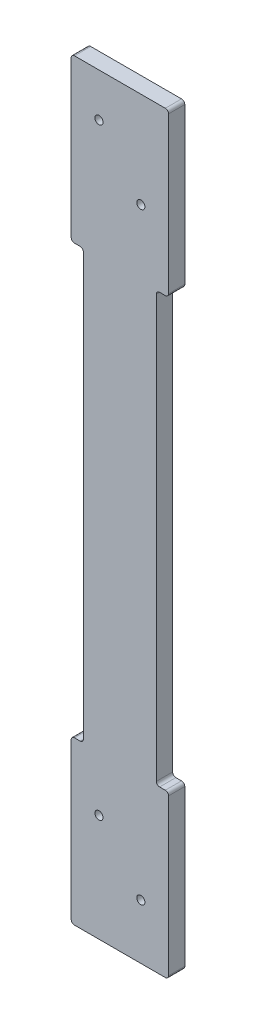
ISO-10303-21;
HEADER;
FILE_DESCRIPTION(('STEP AP214'),'2;1');
FILE_NAME('part.step','',(''),(''),'','','');
FILE_SCHEMA(('AUTOMOTIVE_DESIGN { 1 0 10303 214 1 1 1 1 }'));
ENDSEC;
DATA;
#1=APPLICATION_CONTEXT('core data for automotive mechanical design processes');
#2=APPLICATION_PROTOCOL_DEFINITION('international standard','automotive_design',2000,#1);
#3=PRODUCT_CONTEXT('',#1,'mechanical');
#4=PRODUCT('Part','Part','',(#3));
#5=PRODUCT_RELATED_PRODUCT_CATEGORY('part','',(#4));
#6=PRODUCT_DEFINITION_FORMATION('','',#4);
#7=PRODUCT_DEFINITION_CONTEXT('part definition',#1,'design');
#8=PRODUCT_DEFINITION('design','',#6,#7);
#9=PRODUCT_DEFINITION_SHAPE('','',#8);
#10=(LENGTH_UNIT() NAMED_UNIT(*) SI_UNIT(.MILLI.,.METRE.));
#11=(NAMED_UNIT(*) PLANE_ANGLE_UNIT() SI_UNIT($,.RADIAN.));
#12=(NAMED_UNIT(*) SI_UNIT($,.STERADIAN.) SOLID_ANGLE_UNIT());
#13=UNCERTAINTY_MEASURE_WITH_UNIT(LENGTH_MEASURE(1.E-05),#10,'distance_accuracy_value','');
#14=(GEOMETRIC_REPRESENTATION_CONTEXT(3) GLOBAL_UNCERTAINTY_ASSIGNED_CONTEXT((#13)) GLOBAL_UNIT_ASSIGNED_CONTEXT((#10,
#11,#12)) REPRESENTATION_CONTEXT('',''));
#15=CARTESIAN_POINT('',(0.,0.,0.));
#16=DIRECTION('',(0.,0.,1.));
#17=DIRECTION('',(1.,0.,0.));
#18=AXIS2_PLACEMENT_3D('',#15,#16,#17);
#19=CARTESIAN_POINT('',(0.,-421.200669102115,10.));
#20=DIRECTION('',(0.,1.,0.));
#21=DIRECTION('',(0.,0.,1.));
#22=AXIS2_PLACEMENT_3D('',#19,#20,#21);
#23=PLANE('',#22);
#24=DIRECTION('',(1.,0.,0.));
#25=VECTOR('',#24,1.);
#26=CARTESIAN_POINT('',(0.,-421.200669102115,0.));
#27=LINE('',#26,#25);
#28=CARTESIAN_POINT('',(27.0000000000014,-421.200669102115,0.));
#29=VERTEX_POINT('',#28);
#30=CARTESIAN_POINT('',(83.0000000000014,-421.200669102115,0.));
#31=VERTEX_POINT('',#30);
#32=EDGE_CURVE('E227',#29,#31,#27,.T.);
#33=ORIENTED_EDGE('',*,*,#32,.T.);
#34=DIRECTION('',(0.,0.,-1.));
#35=VECTOR('',#34,1.);
#36=CARTESIAN_POINT('',(83.0000000000014,-421.200669102115,10.));
#37=LINE('',#36,#35);
#38=CARTESIAN_POINT('',(83.0000000000014,-421.200669102115,10.));
#39=VERTEX_POINT('',#38);
#40=EDGE_CURVE('E204',#31,#39,#37,.F.);
#41=ORIENTED_EDGE('',*,*,#40,.T.);
#42=DIRECTION('',(1.,0.,0.));
#43=VECTOR('',#42,1.);
#44=CARTESIAN_POINT('',(0.,-421.200669102115,10.));
#45=LINE('',#44,#43);
#46=CARTESIAN_POINT('',(27.0000000000014,-421.200669102115,10.));
#47=VERTEX_POINT('',#46);
#48=EDGE_CURVE('E471',#47,#39,#45,.T.);
#49=ORIENTED_EDGE('',*,*,#48,.F.);
#50=DIRECTION('',(0.,0.,-1.));
#51=VECTOR('',#50,1.);
#52=CARTESIAN_POINT('',(27.0000000000014,-421.200669102115,0.));
#53=LINE('',#52,#51);
#54=EDGE_CURVE('E209',#47,#29,#53,.T.);
#55=ORIENTED_EDGE('',*,*,#54,.T.);
#56=EDGE_LOOP('',(#33,#41,#49,#55));
#57=FACE_BOUND('',#56,.T.);
#58=ADVANCED_FACE('F37',(#57),#23,.F.);
#59=CARTESIAN_POINT('',(85.0000000000014,0.,10.));
#60=DIRECTION('',(-1.,0.,0.));
#61=DIRECTION('',(0.,0.,1.));
#62=AXIS2_PLACEMENT_3D('',#59,#60,#61);
#63=PLANE('',#62);
#64=DIRECTION('',(0.,1.,0.));
#65=VECTOR('',#64,1.);
#66=CARTESIAN_POINT('',(85.0000000000014,0.,10.));
#67=LINE('',#66,#65);
#68=CARTESIAN_POINT('',(85.0000000000014,-419.200669102115,10.));
#69=VERTEX_POINT('',#68);
#70=CARTESIAN_POINT('',(85.0000000000014,-323.200669102115,10.));
#71=VERTEX_POINT('',#70);
#72=EDGE_CURVE('E219',#69,#71,#67,.T.);
#73=ORIENTED_EDGE('',*,*,#72,.F.);
#74=DIRECTION('',(0.,0.,-1.));
#75=VECTOR('',#74,1.);
#76=CARTESIAN_POINT('',(85.0000000000014,-419.200669102115,10.));
#77=LINE('',#76,#75);
#78=CARTESIAN_POINT('',(85.0000000000014,-419.200669102115,0.));
#79=VERTEX_POINT('',#78);
#80=EDGE_CURVE('E203',#69,#79,#77,.T.);
#81=ORIENTED_EDGE('',*,*,#80,.T.);
#82=DIRECTION('',(0.,1.,0.));
#83=VECTOR('',#82,1.);
#84=CARTESIAN_POINT('',(85.0000000000014,0.,0.));
#85=LINE('',#84,#83);
#86=CARTESIAN_POINT('',(85.0000000000014,-323.200669102115,0.));
#87=VERTEX_POINT('',#86);
#88=EDGE_CURVE('E216',#79,#87,#85,.T.);
#89=ORIENTED_EDGE('',*,*,#88,.T.);
#90=DIRECTION('',(0.,0.,-1.));
#91=VECTOR('',#90,1.);
#92=CARTESIAN_POINT('',(85.0000000000014,-323.200669102115,10.));
#93=LINE('',#92,#91);
#94=EDGE_CURVE('E221',#87,#71,#93,.F.);
#95=ORIENTED_EDGE('',*,*,#94,.T.);
#96=EDGE_LOOP('',(#73,#81,#89,#95));
#97=FACE_BOUND('',#96,.T.);
#98=ADVANCED_FACE('F215',(#97),#63,.F.);
#99=CARTESIAN_POINT('',(0.,-321.200669102115,10.));
#100=DIRECTION('',(0.,1.,0.));
#101=DIRECTION('',(0.,0.,1.));
#102=AXIS2_PLACEMENT_3D('',#99,#100,#101);
#103=PLANE('',#102);
#104=DIRECTION('',(1.,0.,0.));
#105=VECTOR('',#104,1.);
#106=CARTESIAN_POINT('',(0.,-321.200669102115,10.));
#107=LINE('',#106,#105);
#108=CARTESIAN_POINT('',(79.5000000000014,-321.200669102115,10.));
#109=VERTEX_POINT('',#108);
#110=CARTESIAN_POINT('',(83.0000000000014,-321.200669102115,10.));
#111=VERTEX_POINT('',#110);
#112=EDGE_CURVE('E384',#109,#111,#107,.T.);
#113=ORIENTED_EDGE('',*,*,#112,.T.);
#114=DIRECTION('',(0.,0.,-1.));
#115=VECTOR('',#114,1.);
#116=CARTESIAN_POINT('',(83.0000000000014,-321.200669102115,0.));
#117=LINE('',#116,#115);
#118=CARTESIAN_POINT('',(83.0000000000014,-321.200669102115,0.));
#119=VERTEX_POINT('',#118);
#120=EDGE_CURVE('E298',#111,#119,#117,.T.);
#121=ORIENTED_EDGE('',*,*,#120,.T.);
#122=DIRECTION('',(1.,0.,0.));
#123=VECTOR('',#122,1.);
#124=CARTESIAN_POINT('',(0.,-321.200669102115,0.));
#125=LINE('',#124,#123);
#126=CARTESIAN_POINT('',(79.5000000000014,-321.200669102115,0.));
#127=VERTEX_POINT('',#126);
#128=EDGE_CURVE('E226',#127,#119,#125,.T.);
#129=ORIENTED_EDGE('',*,*,#128,.F.);
#130=DIRECTION('',(0.,0.,-1.));
#131=VECTOR('',#130,1.);
#132=CARTESIAN_POINT('',(79.5000000000014,-321.200669102115,10.));
#133=LINE('',#132,#131);
#134=EDGE_CURVE('E296',#127,#109,#133,.F.);
#135=ORIENTED_EDGE('',*,*,#134,.T.);
#136=EDGE_LOOP('',(#113,#121,#129,#135));
#137=FACE_BOUND('',#136,.T.);
#138=ADVANCED_FACE('F425',(#137),#103,.T.);
#139=CARTESIAN_POINT('',(77.5000000000013,0.,10.));
#140=DIRECTION('',(-1.,0.,0.));
#141=DIRECTION('',(0.,-1.,0.));
#142=AXIS2_PLACEMENT_3D('',#139,#140,#141);
#143=PLANE('',#142);
#144=DIRECTION('',(0.,1.,0.));
#145=VECTOR('',#144,1.);
#146=CARTESIAN_POINT('',(77.5000000000013,0.,10.));
#147=LINE('',#146,#145);
#148=CARTESIAN_POINT('',(77.5000000000014,-319.200669102115,10.));
#149=VERTEX_POINT('',#148);
#150=CARTESIAN_POINT('',(77.5000000000013,-59.1428571428576,10.));
#151=VERTEX_POINT('',#150);
#152=EDGE_CURVE('E477',#149,#151,#147,.T.);
#153=ORIENTED_EDGE('',*,*,#152,.F.);
#154=DIRECTION('',(0.,0.,-1.));
#155=VECTOR('',#154,1.);
#156=CARTESIAN_POINT('',(77.5000000000014,-319.200669102115,10.));
#157=LINE('',#156,#155);
#158=CARTESIAN_POINT('',(77.5000000000014,-319.200669102115,0.));
#159=VERTEX_POINT('',#158);
#160=EDGE_CURVE('E303',#149,#159,#157,.T.);
#161=ORIENTED_EDGE('',*,*,#160,.T.);
#162=DIRECTION('',(0.,1.,0.));
#163=VECTOR('',#162,1.);
#164=CARTESIAN_POINT('',(77.5000000000013,0.,0.));
#165=LINE('',#164,#163);
#166=CARTESIAN_POINT('',(77.5000000000013,-59.1428571428576,0.));
#167=VERTEX_POINT('',#166);
#168=EDGE_CURVE('E229',#159,#167,#165,.T.);
#169=ORIENTED_EDGE('',*,*,#168,.T.);
#170=DIRECTION('',(0.,0.,-1.));
#171=VECTOR('',#170,1.);
#172=CARTESIAN_POINT('',(77.5000000000013,-59.1428571428576,10.));
#173=LINE('',#172,#171);
#174=EDGE_CURVE('E301',#167,#151,#173,.F.);
#175=ORIENTED_EDGE('',*,*,#174,.T.);
#176=EDGE_LOOP('',(#153,#161,#169,#175));
#177=FACE_BOUND('',#176,.T.);
#178=ADVANCED_FACE('F428',(#177),#143,.F.);
#179=CARTESIAN_POINT('',(0.,-57.1428571428576,10.));
#180=DIRECTION('',(0.,1.,0.));
#181=DIRECTION('',(-1.,0.,0.));
#182=AXIS2_PLACEMENT_3D('',#179,#180,#181);
#183=PLANE('',#182);
#184=DIRECTION('',(1.,0.,0.));
#185=VECTOR('',#184,1.);
#186=CARTESIAN_POINT('',(0.,-57.1428571428576,10.));
#187=LINE('',#186,#185);
#188=CARTESIAN_POINT('',(79.5000000000013,-57.1428571428576,10.));
#189=VERTEX_POINT('',#188);
#190=CARTESIAN_POINT('',(83.0000000000014,-57.1428571428576,10.));
#191=VERTEX_POINT('',#190);
#192=EDGE_CURVE('E387',#189,#191,#187,.T.);
#193=ORIENTED_EDGE('',*,*,#192,.F.);
#194=DIRECTION('',(0.,0.,-1.));
#195=VECTOR('',#194,1.);
#196=CARTESIAN_POINT('',(79.5000000000013,-57.1428571428576,0.));
#197=LINE('',#196,#195);
#198=CARTESIAN_POINT('',(79.5000000000013,-57.1428571428576,0.));
#199=VERTEX_POINT('',#198);
#200=EDGE_CURVE('E322',#189,#199,#197,.T.);
#201=ORIENTED_EDGE('',*,*,#200,.T.);
#202=DIRECTION('',(1.,0.,0.));
#203=VECTOR('',#202,1.);
#204=CARTESIAN_POINT('',(0.,-57.1428571428576,0.));
#205=LINE('',#204,#203);
#206=CARTESIAN_POINT('',(83.0000000000014,-57.1428571428576,0.));
#207=VERTEX_POINT('',#206);
#208=EDGE_CURVE('E238',#199,#207,#205,.T.);
#209=ORIENTED_EDGE('',*,*,#208,.T.);
#210=DIRECTION('',(0.,0.,-1.));
#211=VECTOR('',#210,1.);
#212=CARTESIAN_POINT('',(83.0000000000014,-57.1428571428576,10.));
#213=LINE('',#212,#211);
#214=EDGE_CURVE('E320',#207,#191,#213,.F.);
#215=ORIENTED_EDGE('',*,*,#214,.T.);
#216=EDGE_LOOP('',(#193,#201,#209,#215));
#217=FACE_BOUND('',#216,.T.);
#218=ADVANCED_FACE('F431',(#217),#183,.F.);
#219=CARTESIAN_POINT('',(85.0000000000014,0.,10.));
#220=DIRECTION('',(1.,0.,0.));
#221=DIRECTION('',(0.,0.,-1.));
#222=AXIS2_PLACEMENT_3D('',#219,#220,#221);
#223=PLANE('',#222);
#224=DIRECTION('',(0.,-1.,0.));
#225=VECTOR('',#224,1.);
#226=CARTESIAN_POINT('',(85.0000000000014,0.,10.));
#227=LINE('',#226,#225);
#228=CARTESIAN_POINT('',(85.0000000000014,40.8571428571424,10.));
#229=VERTEX_POINT('',#228);
#230=CARTESIAN_POINT('',(85.0000000000014,-55.1428571428576,10.));
#231=VERTEX_POINT('',#230);
#232=EDGE_CURVE('E480',#229,#231,#227,.T.);
#233=ORIENTED_EDGE('',*,*,#232,.T.);
#234=DIRECTION('',(0.,0.,-1.));
#235=VECTOR('',#234,1.);
#236=CARTESIAN_POINT('',(85.0000000000014,-55.1428571428576,0.));
#237=LINE('',#236,#235);
#238=CARTESIAN_POINT('',(85.0000000000014,-55.1428571428576,0.));
#239=VERTEX_POINT('',#238);
#240=EDGE_CURVE('E327',#231,#239,#237,.T.);
#241=ORIENTED_EDGE('',*,*,#240,.T.);
#242=DIRECTION('',(0.,-1.,0.));
#243=VECTOR('',#242,1.);
#244=CARTESIAN_POINT('',(85.0000000000014,0.,0.));
#245=LINE('',#244,#243);
#246=CARTESIAN_POINT('',(85.0000000000014,40.8571428571424,0.));
#247=VERTEX_POINT('',#246);
#248=EDGE_CURVE('E241',#247,#239,#245,.T.);
#249=ORIENTED_EDGE('',*,*,#248,.F.);
#250=DIRECTION('',(0.,0.,-1.));
#251=VECTOR('',#250,1.);
#252=CARTESIAN_POINT('',(85.0000000000014,40.8571428571424,10.));
#253=LINE('',#252,#251);
#254=EDGE_CURVE('E325',#247,#229,#253,.F.);
#255=ORIENTED_EDGE('',*,*,#254,.T.);
#256=EDGE_LOOP('',(#233,#241,#249,#255));
#257=FACE_BOUND('',#256,.T.);
#258=ADVANCED_FACE('F433',(#257),#223,.T.);
#259=CARTESIAN_POINT('',(0.,42.8571428571424,10.));
#260=DIRECTION('',(0.,1.,0.));
#261=DIRECTION('',(-1.,0.,0.));
#262=AXIS2_PLACEMENT_3D('',#259,#260,#261);
#263=PLANE('',#262);
#264=DIRECTION('',(1.,0.,0.));
#265=VECTOR('',#264,1.);
#266=CARTESIAN_POINT('',(0.,42.8571428571424,10.));
#267=LINE('',#266,#265);
#268=CARTESIAN_POINT('',(27.0000000000014,42.8571428571424,10.));
#269=VERTEX_POINT('',#268);
#270=CARTESIAN_POINT('',(83.0000000000014,42.8571428571424,10.));
#271=VERTEX_POINT('',#270);
#272=EDGE_CURVE('E482',#269,#271,#267,.T.);
#273=ORIENTED_EDGE('',*,*,#272,.T.);
#274=DIRECTION('',(0.,0.,-1.));
#275=VECTOR('',#274,1.);
#276=CARTESIAN_POINT('',(83.0000000000014,42.8571428571424,10.));
#277=LINE('',#276,#275);
#278=CARTESIAN_POINT('',(83.0000000000014,42.8571428571424,0.));
#279=VERTEX_POINT('',#278);
#280=EDGE_CURVE('E332',#271,#279,#277,.T.);
#281=ORIENTED_EDGE('',*,*,#280,.T.);
#282=DIRECTION('',(1.,0.,0.));
#283=VECTOR('',#282,1.);
#284=CARTESIAN_POINT('',(0.,42.8571428571424,0.));
#285=LINE('',#284,#283);
#286=CARTESIAN_POINT('',(27.0000000000014,42.8571428571424,0.));
#287=VERTEX_POINT('',#286);
#288=EDGE_CURVE('E245',#287,#279,#285,.T.);
#289=ORIENTED_EDGE('',*,*,#288,.F.);
#290=DIRECTION('',(0.,0.,-1.));
#291=VECTOR('',#290,1.);
#292=CARTESIAN_POINT('',(27.0000000000014,42.8571428571424,10.));
#293=LINE('',#292,#291);
#294=EDGE_CURVE('E330',#287,#269,#293,.F.);
#295=ORIENTED_EDGE('',*,*,#294,.T.);
#296=EDGE_LOOP('',(#273,#281,#289,#295));
#297=FACE_BOUND('',#296,.T.);
#298=ADVANCED_FACE('F436',(#297),#263,.T.);
#299=CARTESIAN_POINT('',(25.0000000000014,0.,10.));
#300=DIRECTION('',(1.,0.,0.));
#301=DIRECTION('',(0.,1.,0.));
#302=AXIS2_PLACEMENT_3D('',#299,#300,#301);
#303=PLANE('',#302);
#304=DIRECTION('',(0.,-1.,0.));
#305=VECTOR('',#304,1.);
#306=CARTESIAN_POINT('',(25.0000000000014,0.,10.));
#307=LINE('',#306,#305);
#308=CARTESIAN_POINT('',(25.0000000000013,40.8571428571424,10.));
#309=VERTEX_POINT('',#308);
#310=CARTESIAN_POINT('',(25.0000000000014,-55.1428571428576,10.));
#311=VERTEX_POINT('',#310);
#312=EDGE_CURVE('E385',#309,#311,#307,.T.);
#313=ORIENTED_EDGE('',*,*,#312,.F.);
#314=DIRECTION('',(0.,0.,-1.));
#315=VECTOR('',#314,1.);
#316=CARTESIAN_POINT('',(25.0000000000013,40.8571428571424,0.));
#317=LINE('',#316,#315);
#318=CARTESIAN_POINT('',(25.0000000000013,40.8571428571424,0.));
#319=VERTEX_POINT('',#318);
#320=EDGE_CURVE('E337',#309,#319,#317,.T.);
#321=ORIENTED_EDGE('',*,*,#320,.T.);
#322=DIRECTION('',(0.,-1.,0.));
#323=VECTOR('',#322,1.);
#324=CARTESIAN_POINT('',(25.0000000000014,0.,0.));
#325=LINE('',#324,#323);
#326=CARTESIAN_POINT('',(25.0000000000014,-55.1428571428576,0.));
#327=VERTEX_POINT('',#326);
#328=EDGE_CURVE('E248',#319,#327,#325,.T.);
#329=ORIENTED_EDGE('',*,*,#328,.T.);
#330=DIRECTION('',(0.,0.,-1.));
#331=VECTOR('',#330,1.);
#332=CARTESIAN_POINT('',(25.0000000000014,-55.1428571428576,10.));
#333=LINE('',#332,#331);
#334=EDGE_CURVE('E335',#327,#311,#333,.F.);
#335=ORIENTED_EDGE('',*,*,#334,.T.);
#336=EDGE_LOOP('',(#313,#321,#329,#335));
#337=FACE_BOUND('',#336,.T.);
#338=ADVANCED_FACE('F440',(#337),#303,.F.);
#339=CARTESIAN_POINT('',(27.0000000000014,-57.1428571428576,10.));
#340=VERTEX_POINT('',#339);
#341=CARTESIAN_POINT('',(30.5000000000014,-57.1428571428576,10.));
#342=VERTEX_POINT('',#341);
#343=EDGE_CURVE('E375',#340,#342,#187,.T.);
#344=ORIENTED_EDGE('',*,*,#343,.F.);
#345=DIRECTION('',(0.,0.,-1.));
#346=VECTOR('',#345,1.);
#347=CARTESIAN_POINT('',(27.0000000000014,-57.1428571428576,10.));
#348=LINE('',#347,#346);
#349=CARTESIAN_POINT('',(27.0000000000014,-57.1428571428576,0.));
#350=VERTEX_POINT('',#349);
#351=EDGE_CURVE('E342',#340,#350,#348,.T.);
#352=ORIENTED_EDGE('',*,*,#351,.T.);
#353=CARTESIAN_POINT('',(30.5000000000014,-57.1428571428576,0.));
#354=VERTEX_POINT('',#353);
#355=EDGE_CURVE('E242',#350,#354,#205,.T.);
#356=ORIENTED_EDGE('',*,*,#355,.T.);
#357=DIRECTION('',(0.,0.,-1.));
#358=VECTOR('',#357,1.);
#359=CARTESIAN_POINT('',(30.5000000000014,-57.1428571428576,10.));
#360=LINE('',#359,#358);
#361=EDGE_CURVE('E340',#354,#342,#360,.F.);
#362=ORIENTED_EDGE('',*,*,#361,.T.);
#363=EDGE_LOOP('',(#344,#352,#356,#362));
#364=FACE_BOUND('',#363,.T.);
#365=ADVANCED_FACE('F364',(#364),#183,.F.);
#366=CARTESIAN_POINT('',(32.5000000000014,0.,10.));
#367=DIRECTION('',(-1.,0.,0.));
#368=DIRECTION('',(0.,0.,1.));
#369=AXIS2_PLACEMENT_3D('',#366,#367,#368);
#370=PLANE('',#369);
#371=DIRECTION('',(0.,1.,0.));
#372=VECTOR('',#371,1.);
#373=CARTESIAN_POINT('',(32.5000000000014,0.,0.));
#374=LINE('',#373,#372);
#375=CARTESIAN_POINT('',(32.5000000000014,-319.200669102115,0.));
#376=VERTEX_POINT('',#375);
#377=CARTESIAN_POINT('',(32.5000000000014,-59.1428571428576,0.));
#378=VERTEX_POINT('',#377);
#379=EDGE_CURVE('E251',#376,#378,#374,.T.);
#380=ORIENTED_EDGE('',*,*,#379,.F.);
#381=DIRECTION('',(0.,0.,-1.));
#382=VECTOR('',#381,1.);
#383=CARTESIAN_POINT('',(32.5000000000014,-319.200669102115,10.));
#384=LINE('',#383,#382);
#385=CARTESIAN_POINT('',(32.5000000000014,-319.200669102115,10.));
#386=VERTEX_POINT('',#385);
#387=EDGE_CURVE('E314',#376,#386,#384,.F.);
#388=ORIENTED_EDGE('',*,*,#387,.T.);
#389=DIRECTION('',(0.,1.,0.));
#390=VECTOR('',#389,1.);
#391=CARTESIAN_POINT('',(32.5000000000014,0.,10.));
#392=LINE('',#391,#390);
#393=CARTESIAN_POINT('',(32.5000000000014,-59.1428571428576,10.));
#394=VERTEX_POINT('',#393);
#395=EDGE_CURVE('E373',#386,#394,#392,.T.);
#396=ORIENTED_EDGE('',*,*,#395,.T.);
#397=DIRECTION('',(0.,0.,-1.));
#398=VECTOR('',#397,1.);
#399=CARTESIAN_POINT('',(32.5000000000014,-59.1428571428576,10.));
#400=LINE('',#399,#398);
#401=EDGE_CURVE('E311',#394,#378,#400,.T.);
#402=ORIENTED_EDGE('',*,*,#401,.T.);
#403=EDGE_LOOP('',(#380,#388,#396,#402));
#404=FACE_BOUND('',#403,.T.);
#405=ADVANCED_FACE('F377',(#404),#370,.T.);
#406=CARTESIAN_POINT('',(27.0000000000014,-321.200669102115,10.));
#407=VERTEX_POINT('',#406);
#408=CARTESIAN_POINT('',(30.5000000000014,-321.200669102115,10.));
#409=VERTEX_POINT('',#408);
#410=EDGE_CURVE('E379',#407,#409,#107,.T.);
#411=ORIENTED_EDGE('',*,*,#410,.T.);
#412=DIRECTION('',(0.,0.,-1.));
#413=VECTOR('',#412,1.);
#414=CARTESIAN_POINT('',(30.5000000000014,-321.200669102115,0.));
#415=LINE('',#414,#413);
#416=CARTESIAN_POINT('',(30.5000000000014,-321.200669102115,0.));
#417=VERTEX_POINT('',#416);
#418=EDGE_CURVE('E308',#409,#417,#415,.T.);
#419=ORIENTED_EDGE('',*,*,#418,.T.);
#420=CARTESIAN_POINT('',(27.0000000000014,-321.200669102115,0.));
#421=VERTEX_POINT('',#420);
#422=EDGE_CURVE('E231',#421,#417,#125,.T.);
#423=ORIENTED_EDGE('',*,*,#422,.F.);
#424=DIRECTION('',(0.,0.,-1.));
#425=VECTOR('',#424,1.);
#426=CARTESIAN_POINT('',(27.0000000000014,-321.200669102115,10.));
#427=LINE('',#426,#425);
#428=EDGE_CURVE('E306',#421,#407,#427,.F.);
#429=ORIENTED_EDGE('',*,*,#428,.T.);
#430=EDGE_LOOP('',(#411,#419,#423,#429));
#431=FACE_BOUND('',#430,.T.);
#432=ADVANCED_FACE('F449',(#431),#103,.T.);
#433=CARTESIAN_POINT('',(42.0949203281673,16.1416620367931,10.));
#434=DIRECTION('',(0.,0.,-1.));
#435=DIRECTION('',(-1.,0.,0.));
#436=AXIS2_PLACEMENT_3D('',#433,#434,#435);
#437=CYLINDRICAL_SURFACE('',#436,2.5);
#438=CARTESIAN_POINT('',(42.0949203281673,16.1416620367931,10.));
#439=DIRECTION('',(0.,0.,1.));
#440=DIRECTION('',(1.,0.,0.));
#441=AXIS2_PLACEMENT_3D('',#438,#439,#440);
#442=CIRCLE('',#441,2.5);
#443=CARTESIAN_POINT('',(44.5949203281673,16.1416620367931,10.));
#444=VERTEX_POINT('',#443);
#445=EDGE_CURVE('E392',#444,#444,#442,.T.);
#446=ORIENTED_EDGE('',*,*,#445,.T.);
#447=EDGE_LOOP('',(#446));
#448=FACE_BOUND('',#447,.T.);
#449=CARTESIAN_POINT('',(42.0949203281673,16.1416620367931,0.));
#450=DIRECTION('',(0.,0.,1.));
#451=DIRECTION('',(1.,0.,0.));
#452=AXIS2_PLACEMENT_3D('',#449,#450,#451);
#453=CIRCLE('',#452,2.5);
#454=CARTESIAN_POINT('',(44.5949203281673,16.1416620367931,0.));
#455=VERTEX_POINT('',#454);
#456=EDGE_CURVE('E257',#455,#455,#453,.T.);
#457=ORIENTED_EDGE('',*,*,#456,.F.);
#458=EDGE_LOOP('',(#457));
#459=FACE_BOUND('',#458,.T.);
#460=ADVANCED_FACE('F416',(#448,#459),#437,.F.);
#461=CARTESIAN_POINT('',(25.0000000000014,0.,10.));
#462=DIRECTION('',(-1.,0.,0.));
#463=DIRECTION('',(0.,0.,1.));
#464=AXIS2_PLACEMENT_3D('',#461,#462,#463);
#465=PLANE('',#464);
#466=DIRECTION('',(0.,1.,0.));
#467=VECTOR('',#466,1.);
#468=CARTESIAN_POINT('',(25.0000000000014,0.,10.));
#469=LINE('',#468,#467);
#470=CARTESIAN_POINT('',(25.0000000000014,-419.200669102115,10.));
#471=VERTEX_POINT('',#470);
#472=CARTESIAN_POINT('',(25.0000000000014,-323.200669102115,10.));
#473=VERTEX_POINT('',#472);
#474=EDGE_CURVE('E382',#471,#473,#469,.T.);
#475=ORIENTED_EDGE('',*,*,#474,.T.);
#476=DIRECTION('',(0.,0.,-1.));
#477=VECTOR('',#476,1.);
#478=CARTESIAN_POINT('',(25.0000000000014,-323.200669102115,10.));
#479=LINE('',#478,#477);
#480=CARTESIAN_POINT('',(25.0000000000014,-323.200669102115,0.));
#481=VERTEX_POINT('',#480);
#482=EDGE_CURVE('E317',#473,#481,#479,.T.);
#483=ORIENTED_EDGE('',*,*,#482,.T.);
#484=DIRECTION('',(0.,1.,0.));
#485=VECTOR('',#484,1.);
#486=CARTESIAN_POINT('',(25.0000000000014,0.,0.));
#487=LINE('',#486,#485);
#488=CARTESIAN_POINT('',(25.0000000000014,-419.200669102115,0.));
#489=VERTEX_POINT('',#488);
#490=EDGE_CURVE('E254',#489,#481,#487,.T.);
#491=ORIENTED_EDGE('',*,*,#490,.F.);
#492=DIRECTION('',(0.,0.,-1.));
#493=VECTOR('',#492,1.);
#494=CARTESIAN_POINT('',(25.0000000000014,-419.200669102115,10.));
#495=LINE('',#494,#493);
#496=EDGE_CURVE('E59',#489,#471,#495,.F.);
#497=ORIENTED_EDGE('',*,*,#496,.T.);
#498=EDGE_LOOP('',(#475,#483,#491,#497));
#499=FACE_BOUND('',#498,.T.);
#500=ADVANCED_FACE('F406',(#499),#465,.T.);
#501=CARTESIAN_POINT('',(42.0949203281674,-355.059007065322,10.));
#502=DIRECTION('',(0.,0.,-1.));
#503=DIRECTION('',(-1.,0.,0.));
#504=AXIS2_PLACEMENT_3D('',#501,#502,#503);
#505=CYLINDRICAL_SURFACE('',#504,2.5);
#506=CARTESIAN_POINT('',(42.0949203281674,-355.059007065322,10.));
#507=DIRECTION('',(0.,0.,1.));
#508=DIRECTION('',(1.,0.,0.));
#509=AXIS2_PLACEMENT_3D('',#506,#507,#508);
#510=CIRCLE('',#509,2.5);
#511=CARTESIAN_POINT('',(44.5949203281674,-355.059007065322,10.));
#512=VERTEX_POINT('',#511);
#513=EDGE_CURVE('E470',#512,#512,#510,.T.);
#514=ORIENTED_EDGE('',*,*,#513,.T.);
#515=EDGE_LOOP('',(#514));
#516=FACE_BOUND('',#515,.T.);
#517=CARTESIAN_POINT('',(42.0949203281674,-355.059007065322,0.));
#518=DIRECTION('',(0.,0.,1.));
#519=DIRECTION('',(1.,0.,0.));
#520=AXIS2_PLACEMENT_3D('',#517,#518,#519);
#521=CIRCLE('',#520,2.5);
#522=CARTESIAN_POINT('',(44.5949203281674,-355.059007065322,0.));
#523=VERTEX_POINT('',#522);
#524=EDGE_CURVE('E232',#523,#523,#521,.T.);
#525=ORIENTED_EDGE('',*,*,#524,.F.);
#526=EDGE_LOOP('',(#525));
#527=FACE_BOUND('',#526,.T.);
#528=ADVANCED_FACE('F403',(#516,#527),#505,.F.);
#529=CARTESIAN_POINT('',(67.905079671833,-387.342331138908,10.));
#530=DIRECTION('',(0.,0.,-1.));
#531=DIRECTION('',(-1.,0.,0.));
#532=AXIS2_PLACEMENT_3D('',#529,#530,#531);
#533=CYLINDRICAL_SURFACE('',#532,2.5);
#534=CARTESIAN_POINT('',(67.905079671833,-387.342331138908,10.));
#535=DIRECTION('',(0.,0.,1.));
#536=DIRECTION('',(1.,0.,0.));
#537=AXIS2_PLACEMENT_3D('',#534,#535,#536);
#538=CIRCLE('',#537,2.5);
#539=CARTESIAN_POINT('',(70.405079671833,-387.342331138908,10.));
#540=VERTEX_POINT('',#539);
#541=EDGE_CURVE('E263',#540,#540,#538,.T.);
#542=ORIENTED_EDGE('',*,*,#541,.T.);
#543=EDGE_LOOP('',(#542));
#544=FACE_BOUND('',#543,.T.);
#545=CARTESIAN_POINT('',(67.905079671833,-387.342331138908,0.));
#546=DIRECTION('',(0.,0.,1.));
#547=DIRECTION('',(1.,0.,0.));
#548=AXIS2_PLACEMENT_3D('',#545,#546,#547);
#549=CIRCLE('',#548,2.5);
#550=CARTESIAN_POINT('',(70.405079671833,-387.342331138908,0.));
#551=VERTEX_POINT('',#550);
#552=EDGE_CURVE('E397',#551,#551,#549,.T.);
#553=ORIENTED_EDGE('',*,*,#552,.F.);
#554=EDGE_LOOP('',(#553));
#555=FACE_BOUND('',#554,.T.);
#556=ADVANCED_FACE('F405',(#544,#555),#533,.F.);
#557=CARTESIAN_POINT('',(67.9050796718329,-16.1416620367931,10.));
#558=DIRECTION('',(0.,0.,-1.));
#559=DIRECTION('',(-1.,0.,0.));
#560=AXIS2_PLACEMENT_3D('',#557,#558,#559);
#561=CYLINDRICAL_SURFACE('',#560,2.5);
#562=CARTESIAN_POINT('',(67.9050796718329,-16.1416620367931,10.));
#563=DIRECTION('',(0.,0.,1.));
#564=DIRECTION('',(1.,0.,0.));
#565=AXIS2_PLACEMENT_3D('',#562,#563,#564);
#566=CIRCLE('',#565,2.5);
#567=CARTESIAN_POINT('',(70.4050796718329,-16.1416620367931,10.));
#568=VERTEX_POINT('',#567);
#569=EDGE_CURVE('E264',#568,#568,#566,.T.);
#570=ORIENTED_EDGE('',*,*,#569,.T.);
#571=EDGE_LOOP('',(#570));
#572=FACE_BOUND('',#571,.T.);
#573=CARTESIAN_POINT('',(67.9050796718329,-16.1416620367931,0.));
#574=DIRECTION('',(0.,0.,1.));
#575=DIRECTION('',(1.,0.,0.));
#576=AXIS2_PLACEMENT_3D('',#573,#574,#575);
#577=CIRCLE('',#576,2.5);
#578=CARTESIAN_POINT('',(70.4050796718329,-16.1416620367931,0.));
#579=VERTEX_POINT('',#578);
#580=EDGE_CURVE('E260',#579,#579,#577,.T.);
#581=ORIENTED_EDGE('',*,*,#580,.F.);
#582=EDGE_LOOP('',(#581));
#583=FACE_BOUND('',#582,.T.);
#584=ADVANCED_FACE('F413',(#572,#583),#561,.F.);
#585=CARTESIAN_POINT('',(0.,0.,10.));
#586=DIRECTION('',(0.,0.,1.));
#587=DIRECTION('',(1.,0.,0.));
#588=AXIS2_PLACEMENT_3D('',#585,#586,#587);
#589=PLANE('',#588);
#590=ORIENTED_EDGE('',*,*,#541,.F.);
#591=EDGE_LOOP('',(#590));
#592=FACE_BOUND('',#591,.T.);
#593=ORIENTED_EDGE('',*,*,#513,.F.);
#594=EDGE_LOOP('',(#593));
#595=FACE_BOUND('',#594,.T.);
#596=ORIENTED_EDGE('',*,*,#48,.T.);
#597=CARTESIAN_POINT('',(83.0000000000014,-419.200669102115,10.));
#598=DIRECTION('',(0.,0.,1.));
#599=DIRECTION('',(1.,0.,0.));
#600=AXIS2_PLACEMENT_3D('',#597,#598,#599);
#601=CIRCLE('',#600,2.);
#602=EDGE_CURVE('E294',#39,#69,#601,.T.);
#603=ORIENTED_EDGE('',*,*,#602,.T.);
#604=ORIENTED_EDGE('',*,*,#72,.T.);
#605=CARTESIAN_POINT('',(83.0000000000014,-323.200669102115,10.));
#606=DIRECTION('',(0.,0.,1.));
#607=DIRECTION('',(1.,0.,0.));
#608=AXIS2_PLACEMENT_3D('',#605,#606,#607);
#609=CIRCLE('',#608,2.);
#610=EDGE_CURVE('E292',#71,#111,#609,.T.);
#611=ORIENTED_EDGE('',*,*,#610,.T.);
#612=ORIENTED_EDGE('',*,*,#112,.F.);
#613=CARTESIAN_POINT('',(79.5000000000014,-319.200669102115,10.));
#614=DIRECTION('',(0.,0.,1.));
#615=DIRECTION('',(1.,0.,0.));
#616=AXIS2_PLACEMENT_3D('',#613,#614,#615);
#617=CIRCLE('',#616,2.);
#618=EDGE_CURVE('E347',#109,#149,#617,.F.);
#619=ORIENTED_EDGE('',*,*,#618,.T.);
#620=ORIENTED_EDGE('',*,*,#152,.T.);
#621=CARTESIAN_POINT('',(79.5000000000013,-59.1428571428576,10.));
#622=DIRECTION('',(0.,0.,1.));
#623=DIRECTION('',(1.,0.,0.));
#624=AXIS2_PLACEMENT_3D('',#621,#622,#623);
#625=CIRCLE('',#624,2.);
#626=EDGE_CURVE('E355',#151,#189,#625,.F.);
#627=ORIENTED_EDGE('',*,*,#626,.T.);
#628=ORIENTED_EDGE('',*,*,#192,.T.);
#629=CARTESIAN_POINT('',(83.0000000000014,-55.1428571428576,10.));
#630=DIRECTION('',(0.,0.,1.));
#631=DIRECTION('',(1.,0.,0.));
#632=AXIS2_PLACEMENT_3D('',#629,#630,#631);
#633=CIRCLE('',#632,2.);
#634=EDGE_CURVE('E287',#191,#231,#633,.T.);
#635=ORIENTED_EDGE('',*,*,#634,.T.);
#636=ORIENTED_EDGE('',*,*,#232,.F.);
#637=CARTESIAN_POINT('',(83.0000000000014,40.8571428571424,10.));
#638=DIRECTION('',(0.,0.,1.));
#639=DIRECTION('',(1.,0.,0.));
#640=AXIS2_PLACEMENT_3D('',#637,#638,#639);
#641=CIRCLE('',#640,2.);
#642=EDGE_CURVE('E285',#229,#271,#641,.T.);
#643=ORIENTED_EDGE('',*,*,#642,.T.);
#644=ORIENTED_EDGE('',*,*,#272,.F.);
#645=CARTESIAN_POINT('',(27.0000000000014,40.8571428571424,10.));
#646=DIRECTION('',(0.,0.,1.));
#647=DIRECTION('',(1.,0.,0.));
#648=AXIS2_PLACEMENT_3D('',#645,#646,#647);
#649=CIRCLE('',#648,2.);
#650=EDGE_CURVE('E283',#269,#309,#649,.T.);
#651=ORIENTED_EDGE('',*,*,#650,.T.);
#652=ORIENTED_EDGE('',*,*,#312,.T.);
#653=CARTESIAN_POINT('',(27.0000000000014,-55.1428571428576,10.));
#654=DIRECTION('',(0.,0.,1.));
#655=DIRECTION('',(1.,0.,0.));
#656=AXIS2_PLACEMENT_3D('',#653,#654,#655);
#657=CIRCLE('',#656,2.);
#658=EDGE_CURVE('E281',#311,#340,#657,.T.);
#659=ORIENTED_EDGE('',*,*,#658,.T.);
#660=ORIENTED_EDGE('',*,*,#343,.T.);
#661=CARTESIAN_POINT('',(30.5000000000014,-59.1428571428576,10.));
#662=DIRECTION('',(0.,0.,1.));
#663=DIRECTION('',(1.,0.,0.));
#664=AXIS2_PLACEMENT_3D('',#661,#662,#663);
#665=CIRCLE('',#664,2.);
#666=EDGE_CURVE('E11',#342,#394,#665,.F.);
#667=ORIENTED_EDGE('',*,*,#666,.T.);
#668=ORIENTED_EDGE('',*,*,#395,.F.);
#669=CARTESIAN_POINT('',(30.5000000000014,-319.200669102115,10.));
#670=DIRECTION('',(0.,0.,1.));
#671=DIRECTION('',(1.,0.,0.));
#672=AXIS2_PLACEMENT_3D('',#669,#670,#671);
#673=CIRCLE('',#672,2.);
#674=EDGE_CURVE('E351',#386,#409,#673,.F.);
#675=ORIENTED_EDGE('',*,*,#674,.T.);
#676=ORIENTED_EDGE('',*,*,#410,.F.);
#677=CARTESIAN_POINT('',(27.0000000000014,-323.200669102115,10.));
#678=DIRECTION('',(0.,0.,1.));
#679=DIRECTION('',(1.,0.,0.));
#680=AXIS2_PLACEMENT_3D('',#677,#678,#679);
#681=CIRCLE('',#680,2.);
#682=EDGE_CURVE('E52',#407,#473,#681,.T.);
#683=ORIENTED_EDGE('',*,*,#682,.T.);
#684=ORIENTED_EDGE('',*,*,#474,.F.);
#685=CARTESIAN_POINT('',(27.0000000000014,-419.200669102115,10.));
#686=DIRECTION('',(0.,0.,1.));
#687=DIRECTION('',(1.,0.,0.));
#688=AXIS2_PLACEMENT_3D('',#685,#686,#687);
#689=CIRCLE('',#688,2.);
#690=EDGE_CURVE('E289',#471,#47,#689,.T.);
#691=ORIENTED_EDGE('',*,*,#690,.T.);
#692=EDGE_LOOP('',(#596,#603,#604,#611,#612,#619,#620,#627,#628,#635,#636,#643,#644,#651,#652,
#659,#660,#667,#668,#675,#676,#683,#684,#691));
#693=FACE_BOUND('',#692,.T.);
#694=ORIENTED_EDGE('',*,*,#445,.F.);
#695=EDGE_LOOP('',(#694));
#696=FACE_BOUND('',#695,.T.);
#697=ORIENTED_EDGE('',*,*,#569,.F.);
#698=EDGE_LOOP('',(#697));
#699=FACE_BOUND('',#698,.T.);
#700=ADVANCED_FACE('F371',(#592,#595,#693,#696,#699),#589,.T.);
#701=CARTESIAN_POINT('',(0.,0.,0.));
#702=DIRECTION('',(0.,0.,1.));
#703=DIRECTION('',(1.,0.,0.));
#704=AXIS2_PLACEMENT_3D('',#701,#702,#703);
#705=PLANE('',#704);
#706=ORIENTED_EDGE('',*,*,#552,.T.);
#707=EDGE_LOOP('',(#706));
#708=FACE_BOUND('',#707,.T.);
#709=ORIENTED_EDGE('',*,*,#524,.T.);
#710=EDGE_LOOP('',(#709));
#711=FACE_BOUND('',#710,.T.);
#712=ORIENTED_EDGE('',*,*,#88,.F.);
#713=CARTESIAN_POINT('',(83.0000000000014,-419.200669102115,0.));
#714=DIRECTION('',(0.,0.,1.));
#715=DIRECTION('',(1.,0.,0.));
#716=AXIS2_PLACEMENT_3D('',#713,#714,#715);
#717=CIRCLE('',#716,2.);
#718=EDGE_CURVE('E199',#79,#31,#717,.F.);
#719=ORIENTED_EDGE('',*,*,#718,.T.);
#720=ORIENTED_EDGE('',*,*,#32,.F.);
#721=CARTESIAN_POINT('',(27.0000000000014,-419.200669102115,0.));
#722=DIRECTION('',(0.,0.,1.));
#723=DIRECTION('',(1.,0.,0.));
#724=AXIS2_PLACEMENT_3D('',#721,#722,#723);
#725=CIRCLE('',#724,2.);
#726=EDGE_CURVE('E273',#29,#489,#725,.F.);
#727=ORIENTED_EDGE('',*,*,#726,.T.);
#728=ORIENTED_EDGE('',*,*,#490,.T.);
#729=CARTESIAN_POINT('',(27.0000000000014,-323.200669102115,0.));
#730=DIRECTION('',(0.,0.,1.));
#731=DIRECTION('',(1.,0.,0.));
#732=AXIS2_PLACEMENT_3D('',#729,#730,#731);
#733=CIRCLE('',#732,2.);
#734=EDGE_CURVE('E275',#481,#421,#733,.F.);
#735=ORIENTED_EDGE('',*,*,#734,.T.);
#736=ORIENTED_EDGE('',*,*,#422,.T.);
#737=CARTESIAN_POINT('',(30.5000000000014,-319.200669102115,0.));
#738=DIRECTION('',(0.,0.,1.));
#739=DIRECTION('',(1.,0.,0.));
#740=AXIS2_PLACEMENT_3D('',#737,#738,#739);
#741=CIRCLE('',#740,2.);
#742=EDGE_CURVE('E349',#417,#376,#741,.T.);
#743=ORIENTED_EDGE('',*,*,#742,.T.);
#744=ORIENTED_EDGE('',*,*,#379,.T.);
#745=CARTESIAN_POINT('',(30.5000000000014,-59.1428571428576,0.));
#746=DIRECTION('',(0.,0.,1.));
#747=DIRECTION('',(1.,0.,0.));
#748=AXIS2_PLACEMENT_3D('',#745,#746,#747);
#749=CIRCLE('',#748,2.);
#750=EDGE_CURVE('E45',#378,#354,#749,.T.);
#751=ORIENTED_EDGE('',*,*,#750,.T.);
#752=ORIENTED_EDGE('',*,*,#355,.F.);
#753=CARTESIAN_POINT('',(27.0000000000014,-55.1428571428576,0.));
#754=DIRECTION('',(0.,0.,1.));
#755=DIRECTION('',(1.,0.,0.));
#756=AXIS2_PLACEMENT_3D('',#753,#754,#755);
#757=CIRCLE('',#756,2.);
#758=EDGE_CURVE('E220',#350,#327,#757,.F.);
#759=ORIENTED_EDGE('',*,*,#758,.T.);
#760=ORIENTED_EDGE('',*,*,#328,.F.);
#761=CARTESIAN_POINT('',(27.0000000000014,40.8571428571424,0.));
#762=DIRECTION('',(0.,0.,1.));
#763=DIRECTION('',(1.,0.,0.));
#764=AXIS2_PLACEMENT_3D('',#761,#762,#763);
#765=CIRCLE('',#764,2.);
#766=EDGE_CURVE('E267',#319,#287,#765,.F.);
#767=ORIENTED_EDGE('',*,*,#766,.T.);
#768=ORIENTED_EDGE('',*,*,#288,.T.);
#769=CARTESIAN_POINT('',(83.0000000000014,40.8571428571424,0.));
#770=DIRECTION('',(0.,0.,1.));
#771=DIRECTION('',(1.,0.,0.));
#772=AXIS2_PLACEMENT_3D('',#769,#770,#771);
#773=CIRCLE('',#772,2.);
#774=EDGE_CURVE('E269',#279,#247,#773,.F.);
#775=ORIENTED_EDGE('',*,*,#774,.T.);
#776=ORIENTED_EDGE('',*,*,#248,.T.);
#777=CARTESIAN_POINT('',(83.0000000000014,-55.1428571428576,0.));
#778=DIRECTION('',(0.,0.,1.));
#779=DIRECTION('',(1.,0.,0.));
#780=AXIS2_PLACEMENT_3D('',#777,#778,#779);
#781=CIRCLE('',#780,2.);
#782=EDGE_CURVE('E271',#239,#207,#781,.F.);
#783=ORIENTED_EDGE('',*,*,#782,.T.);
#784=ORIENTED_EDGE('',*,*,#208,.F.);
#785=CARTESIAN_POINT('',(79.5000000000013,-59.1428571428576,0.));
#786=DIRECTION('',(0.,0.,1.));
#787=DIRECTION('',(1.,0.,0.));
#788=AXIS2_PLACEMENT_3D('',#785,#786,#787);
#789=CIRCLE('',#788,2.);
#790=EDGE_CURVE('E353',#199,#167,#789,.T.);
#791=ORIENTED_EDGE('',*,*,#790,.T.);
#792=ORIENTED_EDGE('',*,*,#168,.F.);
#793=CARTESIAN_POINT('',(79.5000000000014,-319.200669102115,0.));
#794=DIRECTION('',(0.,0.,1.));
#795=DIRECTION('',(1.,0.,0.));
#796=AXIS2_PLACEMENT_3D('',#793,#794,#795);
#797=CIRCLE('',#796,2.);
#798=EDGE_CURVE('E345',#159,#127,#797,.T.);
#799=ORIENTED_EDGE('',*,*,#798,.T.);
#800=ORIENTED_EDGE('',*,*,#128,.T.);
#801=CARTESIAN_POINT('',(83.0000000000014,-323.200669102115,0.));
#802=DIRECTION('',(0.,0.,1.));
#803=DIRECTION('',(1.,0.,0.));
#804=AXIS2_PLACEMENT_3D('',#801,#802,#803);
#805=CIRCLE('',#804,2.);
#806=EDGE_CURVE('E210',#119,#87,#805,.F.);
#807=ORIENTED_EDGE('',*,*,#806,.T.);
#808=EDGE_LOOP('',(#712,#719,#720,#727,#728,#735,#736,#743,#744,#751,#752,#759,#760,#767,#768,
#775,#776,#783,#784,#791,#792,#799,#800,#807));
#809=FACE_BOUND('',#808,.T.);
#810=ORIENTED_EDGE('',*,*,#456,.T.);
#811=EDGE_LOOP('',(#810));
#812=FACE_BOUND('',#811,.T.);
#813=ORIENTED_EDGE('',*,*,#580,.T.);
#814=EDGE_LOOP('',(#813));
#815=FACE_BOUND('',#814,.T.);
#816=ADVANCED_FACE('F223',(#708,#711,#809,#812,#815),#705,.F.);
#817=CARTESIAN_POINT('',(83.0000000000014,-419.200669102115,10.));
#818=DIRECTION('',(0.,0.,-1.));
#819=DIRECTION('',(-1.,0.,0.));
#820=AXIS2_PLACEMENT_3D('',#817,#818,#819);
#821=CYLINDRICAL_SURFACE('',#820,2.);
#822=ORIENTED_EDGE('',*,*,#602,.F.);
#823=ORIENTED_EDGE('',*,*,#40,.F.);
#824=ORIENTED_EDGE('',*,*,#718,.F.);
#825=ORIENTED_EDGE('',*,*,#80,.F.);
#826=EDGE_LOOP('',(#822,#823,#824,#825));
#827=FACE_BOUND('',#826,.T.);
#828=ADVANCED_FACE('F202',(#827),#821,.T.);
#829=CARTESIAN_POINT('',(83.0000000000014,-323.200669102115,10.));
#830=DIRECTION('',(0.,0.,1.));
#831=DIRECTION('',(1.,0.,0.));
#832=AXIS2_PLACEMENT_3D('',#829,#830,#831);
#833=CYLINDRICAL_SURFACE('',#832,2.);
#834=ORIENTED_EDGE('',*,*,#610,.F.);
#835=ORIENTED_EDGE('',*,*,#94,.F.);
#836=ORIENTED_EDGE('',*,*,#806,.F.);
#837=ORIENTED_EDGE('',*,*,#120,.F.);
#838=EDGE_LOOP('',(#834,#835,#836,#837));
#839=FACE_BOUND('',#838,.T.);
#840=ADVANCED_FACE('F533',(#839),#833,.T.);
#841=CARTESIAN_POINT('',(79.5000000000014,-319.200669102115,10.));
#842=DIRECTION('',(0.,0.,-1.));
#843=DIRECTION('',(-1.,0.,0.));
#844=AXIS2_PLACEMENT_3D('',#841,#842,#843);
#845=CYLINDRICAL_SURFACE('',#844,2.);
#846=ORIENTED_EDGE('',*,*,#618,.F.);
#847=ORIENTED_EDGE('',*,*,#134,.F.);
#848=ORIENTED_EDGE('',*,*,#798,.F.);
#849=ORIENTED_EDGE('',*,*,#160,.F.);
#850=EDGE_LOOP('',(#846,#847,#848,#849));
#851=FACE_BOUND('',#850,.T.);
#852=ADVANCED_FACE('F524',(#851),#845,.F.);
#853=CARTESIAN_POINT('',(30.5000000000014,-319.200669102115,10.));
#854=DIRECTION('',(0.,0.,1.));
#855=DIRECTION('',(1.,0.,0.));
#856=AXIS2_PLACEMENT_3D('',#853,#854,#855);
#857=CYLINDRICAL_SURFACE('',#856,2.);
#858=ORIENTED_EDGE('',*,*,#674,.F.);
#859=ORIENTED_EDGE('',*,*,#387,.F.);
#860=ORIENTED_EDGE('',*,*,#742,.F.);
#861=ORIENTED_EDGE('',*,*,#418,.F.);
#862=EDGE_LOOP('',(#858,#859,#860,#861));
#863=FACE_BOUND('',#862,.T.);
#864=ADVANCED_FACE('F547',(#863),#857,.F.);
#865=CARTESIAN_POINT('',(27.0000000000014,-323.200669102115,10.));
#866=DIRECTION('',(0.,0.,-1.));
#867=DIRECTION('',(-1.,0.,0.));
#868=AXIS2_PLACEMENT_3D('',#865,#866,#867);
#869=CYLINDRICAL_SURFACE('',#868,2.);
#870=ORIENTED_EDGE('',*,*,#682,.F.);
#871=ORIENTED_EDGE('',*,*,#428,.F.);
#872=ORIENTED_EDGE('',*,*,#734,.F.);
#873=ORIENTED_EDGE('',*,*,#482,.F.);
#874=EDGE_LOOP('',(#870,#871,#872,#873));
#875=FACE_BOUND('',#874,.T.);
#876=ADVANCED_FACE('F541',(#875),#869,.T.);
#877=CARTESIAN_POINT('',(27.0000000000014,-419.200669102115,10.));
#878=DIRECTION('',(0.,0.,1.));
#879=DIRECTION('',(1.,0.,0.));
#880=AXIS2_PLACEMENT_3D('',#877,#878,#879);
#881=CYLINDRICAL_SURFACE('',#880,2.);
#882=ORIENTED_EDGE('',*,*,#690,.F.);
#883=ORIENTED_EDGE('',*,*,#496,.F.);
#884=ORIENTED_EDGE('',*,*,#726,.F.);
#885=ORIENTED_EDGE('',*,*,#54,.F.);
#886=EDGE_LOOP('',(#882,#883,#884,#885));
#887=FACE_BOUND('',#886,.T.);
#888=ADVANCED_FACE('F538',(#887),#881,.T.);
#889=CARTESIAN_POINT('',(79.5000000000013,-59.1428571428576,10.));
#890=DIRECTION('',(0.,0.,1.));
#891=DIRECTION('',(1.,0.,0.));
#892=AXIS2_PLACEMENT_3D('',#889,#890,#891);
#893=CYLINDRICAL_SURFACE('',#892,2.);
#894=ORIENTED_EDGE('',*,*,#626,.F.);
#895=ORIENTED_EDGE('',*,*,#174,.F.);
#896=ORIENTED_EDGE('',*,*,#790,.F.);
#897=ORIENTED_EDGE('',*,*,#200,.F.);
#898=EDGE_LOOP('',(#894,#895,#896,#897));
#899=FACE_BOUND('',#898,.T.);
#900=ADVANCED_FACE('F517',(#899),#893,.F.);
#901=CARTESIAN_POINT('',(83.0000000000014,-55.1428571428576,10.));
#902=DIRECTION('',(0.,0.,1.));
#903=DIRECTION('',(1.,0.,0.));
#904=AXIS2_PLACEMENT_3D('',#901,#902,#903);
#905=CYLINDRICAL_SURFACE('',#904,2.);
#906=ORIENTED_EDGE('',*,*,#634,.F.);
#907=ORIENTED_EDGE('',*,*,#214,.F.);
#908=ORIENTED_EDGE('',*,*,#782,.F.);
#909=ORIENTED_EDGE('',*,*,#240,.F.);
#910=EDGE_LOOP('',(#906,#907,#908,#909));
#911=FACE_BOUND('',#910,.T.);
#912=ADVANCED_FACE('F508',(#911),#905,.T.);
#913=CARTESIAN_POINT('',(83.0000000000014,40.8571428571424,10.));
#914=DIRECTION('',(0.,0.,-1.));
#915=DIRECTION('',(-1.,0.,0.));
#916=AXIS2_PLACEMENT_3D('',#913,#914,#915);
#917=CYLINDRICAL_SURFACE('',#916,2.);
#918=ORIENTED_EDGE('',*,*,#642,.F.);
#919=ORIENTED_EDGE('',*,*,#254,.F.);
#920=ORIENTED_EDGE('',*,*,#774,.F.);
#921=ORIENTED_EDGE('',*,*,#280,.F.);
#922=EDGE_LOOP('',(#918,#919,#920,#921));
#923=FACE_BOUND('',#922,.T.);
#924=ADVANCED_FACE('F501',(#923),#917,.T.);
#925=CARTESIAN_POINT('',(27.0000000000014,40.8571428571424,10.));
#926=DIRECTION('',(0.,0.,1.));
#927=DIRECTION('',(1.,0.,0.));
#928=AXIS2_PLACEMENT_3D('',#925,#926,#927);
#929=CYLINDRICAL_SURFACE('',#928,2.);
#930=ORIENTED_EDGE('',*,*,#650,.F.);
#931=ORIENTED_EDGE('',*,*,#294,.F.);
#932=ORIENTED_EDGE('',*,*,#766,.F.);
#933=ORIENTED_EDGE('',*,*,#320,.F.);
#934=EDGE_LOOP('',(#930,#931,#932,#933));
#935=FACE_BOUND('',#934,.T.);
#936=ADVANCED_FACE('F496',(#935),#929,.T.);
#937=CARTESIAN_POINT('',(27.0000000000014,-55.1428571428576,10.));
#938=DIRECTION('',(0.,0.,-1.));
#939=DIRECTION('',(-1.,0.,0.));
#940=AXIS2_PLACEMENT_3D('',#937,#938,#939);
#941=CYLINDRICAL_SURFACE('',#940,2.);
#942=ORIENTED_EDGE('',*,*,#658,.F.);
#943=ORIENTED_EDGE('',*,*,#334,.F.);
#944=ORIENTED_EDGE('',*,*,#758,.F.);
#945=ORIENTED_EDGE('',*,*,#351,.F.);
#946=EDGE_LOOP('',(#942,#943,#944,#945));
#947=FACE_BOUND('',#946,.T.);
#948=ADVANCED_FACE('F493',(#947),#941,.T.);
#949=CARTESIAN_POINT('',(30.5000000000014,-59.1428571428576,10.));
#950=DIRECTION('',(0.,0.,-1.));
#951=DIRECTION('',(-1.,0.,0.));
#952=AXIS2_PLACEMENT_3D('',#949,#950,#951);
#953=CYLINDRICAL_SURFACE('',#952,2.);
#954=ORIENTED_EDGE('',*,*,#666,.F.);
#955=ORIENTED_EDGE('',*,*,#361,.F.);
#956=ORIENTED_EDGE('',*,*,#750,.F.);
#957=ORIENTED_EDGE('',*,*,#401,.F.);
#958=EDGE_LOOP('',(#954,#955,#956,#957));
#959=FACE_BOUND('',#958,.T.);
#960=ADVANCED_FACE('F39',(#959),#953,.F.);
#961=CLOSED_SHELL('',(#58,#98,#138,#178,#218,#258,#298,#338,#365,#405,#432,#460,#500,#528,#556,
#584,#700,#816,#828,#840,#852,#864,#876,#888,#900,#912,#924,#936,#948,#960));
#962=MANIFOLD_SOLID_BREP('B2',#961);
#963=ADVANCED_BREP_SHAPE_REPRESENTATION('',(#18,#962),#14);
#964=SHAPE_DEFINITION_REPRESENTATION(#9,#963);
ENDSEC;
END-ISO-10303-21;
